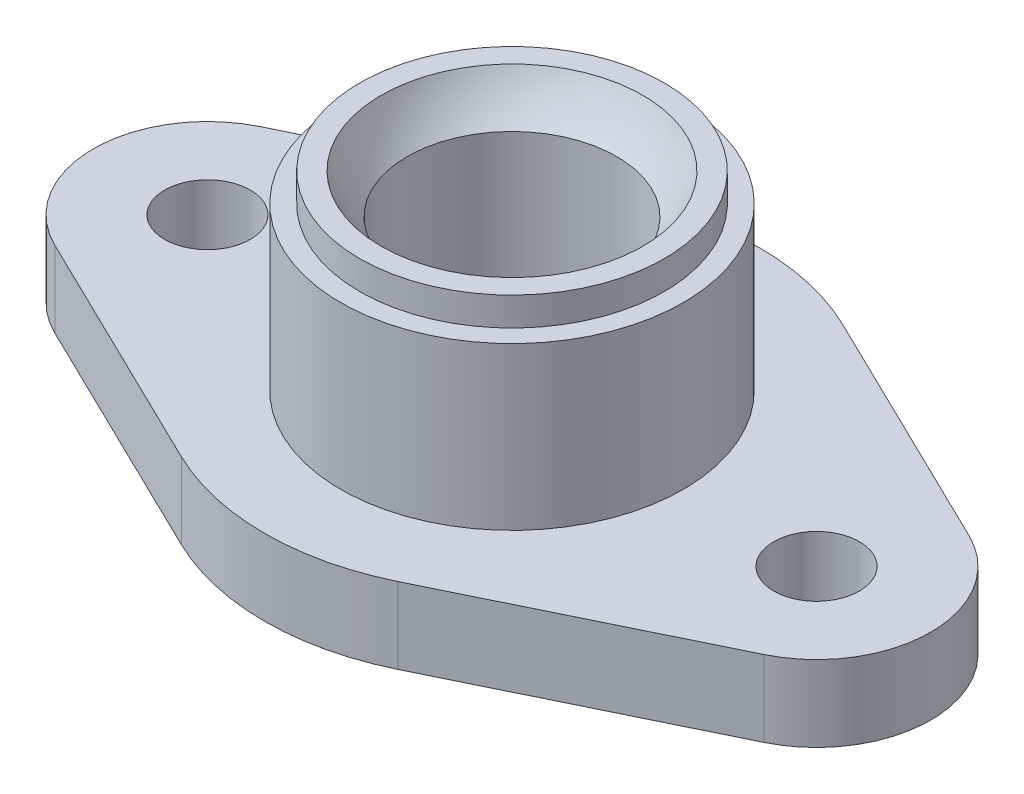
ISO-10303-21;
HEADER;
FILE_DESCRIPTION(('STEP AP214'),'2;1');
FILE_NAME('part.step','',(''),(''),'','','');
FILE_SCHEMA(('AUTOMOTIVE_DESIGN { 1 0 10303 214 1 1 1 1 }'));
ENDSEC;
DATA;
#1=APPLICATION_CONTEXT('core data for automotive mechanical design processes');
#2=APPLICATION_PROTOCOL_DEFINITION('international standard','automotive_design',2000,#1);
#3=PRODUCT_CONTEXT('',#1,'mechanical');
#4=PRODUCT('Part','Part','',(#3));
#5=PRODUCT_RELATED_PRODUCT_CATEGORY('part','',(#4));
#6=PRODUCT_DEFINITION_FORMATION('','',#4);
#7=PRODUCT_DEFINITION_CONTEXT('part definition',#1,'design');
#8=PRODUCT_DEFINITION('design','',#6,#7);
#9=PRODUCT_DEFINITION_SHAPE('','',#8);
#10=(LENGTH_UNIT() NAMED_UNIT(*) SI_UNIT(.MILLI.,.METRE.));
#11=(NAMED_UNIT(*) PLANE_ANGLE_UNIT() SI_UNIT($,.RADIAN.));
#12=(NAMED_UNIT(*) SI_UNIT($,.STERADIAN.) SOLID_ANGLE_UNIT());
#13=UNCERTAINTY_MEASURE_WITH_UNIT(LENGTH_MEASURE(1.E-05),#10,'distance_accuracy_value','');
#14=(GEOMETRIC_REPRESENTATION_CONTEXT(3) GLOBAL_UNCERTAINTY_ASSIGNED_CONTEXT((#13)) GLOBAL_UNIT_ASSIGNED_CONTEXT((#10,
#11,#12)) REPRESENTATION_CONTEXT('',''));
#15=CARTESIAN_POINT('',(0.,0.,0.));
#16=DIRECTION('',(0.,0.,1.));
#17=DIRECTION('',(1.,0.,0.));
#18=AXIS2_PLACEMENT_3D('',#15,#16,#17);
#19=CARTESIAN_POINT('',(-32.,8.,0.));
#20=DIRECTION('',(0.,1.,0.));
#21=DIRECTION('',(0.,0.,1.));
#22=AXIS2_PLACEMENT_3D('',#19,#20,#21);
#23=PLANE('',#22);
#24=CARTESIAN_POINT('',(32.,8.,0.));
#25=DIRECTION('',(0.,1.,0.));
#26=DIRECTION('',(0.,0.,1.));
#27=AXIS2_PLACEMENT_3D('',#24,#25,#26);
#28=CIRCLE('',#27,4.5);
#29=CARTESIAN_POINT('',(32.,8.,4.5));
#30=VERTEX_POINT('',#29);
#31=EDGE_CURVE('E273',#30,#30,#28,.T.);
#32=ORIENTED_EDGE('',*,*,#31,.F.);
#33=EDGE_LOOP('',(#32));
#34=FACE_BOUND('',#33,.T.);
#35=CARTESIAN_POINT('',(-32.,8.,0.));
#36=DIRECTION('',(0.,1.,0.));
#37=DIRECTION('',(0.,0.,1.));
#38=AXIS2_PLACEMENT_3D('',#35,#36,#37);
#39=CIRCLE('',#38,12.);
#40=CARTESIAN_POINT('',(-37.25,8.,-10.7906209274536));
#41=VERTEX_POINT('',#40);
#42=CARTESIAN_POINT('',(-37.25,8.,10.7906209274536));
#43=VERTEX_POINT('',#42);
#44=EDGE_CURVE('E172',#41,#43,#39,.T.);
#45=ORIENTED_EDGE('',*,*,#44,.T.);
#46=DIRECTION('',(0.899218410621135,0.,0.4375));
#47=VECTOR('',#46,1.);
#48=CARTESIAN_POINT('',(-37.25,8.,10.7906209274536));
#49=LINE('',#48,#47);
#50=CARTESIAN_POINT('',(-11.375,8.,23.3796786761495));
#51=VERTEX_POINT('',#50);
#52=EDGE_CURVE('E108',#43,#51,#49,.T.);
#53=ORIENTED_EDGE('',*,*,#52,.T.);
#54=CARTESIAN_POINT('',(0.,8.,0.));
#55=DIRECTION('',(0.,1.,0.));
#56=DIRECTION('',(0.,0.,1.));
#57=AXIS2_PLACEMENT_3D('',#54,#55,#56);
#58=CIRCLE('',#57,26.);
#59=CARTESIAN_POINT('',(11.375,8.,23.3796786761495));
#60=VERTEX_POINT('',#59);
#61=EDGE_CURVE('E256',#51,#60,#58,.T.);
#62=ORIENTED_EDGE('',*,*,#61,.T.);
#63=DIRECTION('',(0.899218410621135,0.,-0.4375));
#64=VECTOR('',#63,1.);
#65=CARTESIAN_POINT('',(37.25,8.,10.7906209274536));
#66=LINE('',#65,#64);
#67=CARTESIAN_POINT('',(37.25,8.,10.7906209274536));
#68=VERTEX_POINT('',#67);
#69=EDGE_CURVE('E259',#60,#68,#66,.T.);
#70=ORIENTED_EDGE('',*,*,#69,.T.);
#71=CARTESIAN_POINT('',(32.,8.,0.));
#72=DIRECTION('',(0.,1.,0.));
#73=DIRECTION('',(0.,0.,-1.));
#74=AXIS2_PLACEMENT_3D('',#71,#72,#73);
#75=CIRCLE('',#74,12.);
#76=CARTESIAN_POINT('',(37.25,8.,-10.7906209274536));
#77=VERTEX_POINT('',#76);
#78=EDGE_CURVE('E127',#68,#77,#75,.T.);
#79=ORIENTED_EDGE('',*,*,#78,.T.);
#80=DIRECTION('',(-0.899218410621135,0.,-0.4375));
#81=VECTOR('',#80,1.);
#82=CARTESIAN_POINT('',(37.25,8.,-10.7906209274536));
#83=LINE('',#82,#81);
#84=CARTESIAN_POINT('',(11.375,8.,-23.3796786761495));
#85=VERTEX_POINT('',#84);
#86=EDGE_CURVE('E121',#77,#85,#83,.T.);
#87=ORIENTED_EDGE('',*,*,#86,.T.);
#88=CARTESIAN_POINT('',(0.,8.,0.));
#89=DIRECTION('',(0.,1.,0.));
#90=DIRECTION('',(0.,0.,1.));
#91=AXIS2_PLACEMENT_3D('',#88,#89,#90);
#92=CIRCLE('',#91,26.);
#93=CARTESIAN_POINT('',(-11.375,8.,-23.3796786761495));
#94=VERTEX_POINT('',#93);
#95=EDGE_CURVE('E125',#85,#94,#92,.T.);
#96=ORIENTED_EDGE('',*,*,#95,.T.);
#97=DIRECTION('',(-0.899218410621135,0.,0.4375));
#98=VECTOR('',#97,1.);
#99=CARTESIAN_POINT('',(-37.25,8.,-10.7906209274536));
#100=LINE('',#99,#98);
#101=EDGE_CURVE('E64',#94,#41,#100,.T.);
#102=ORIENTED_EDGE('',*,*,#101,.T.);
#103=EDGE_LOOP('',(#45,#53,#62,#70,#79,#87,#96,#102));
#104=FACE_BOUND('',#103,.T.);
#105=CARTESIAN_POINT('',(-32.,8.,0.));
#106=DIRECTION('',(0.,1.,0.));
#107=DIRECTION('',(0.,0.,1.));
#108=AXIS2_PLACEMENT_3D('',#105,#106,#107);
#109=CIRCLE('',#108,4.5);
#110=CARTESIAN_POINT('',(-32.,8.,4.5));
#111=VERTEX_POINT('',#110);
#112=EDGE_CURVE('E154',#111,#111,#109,.T.);
#113=ORIENTED_EDGE('',*,*,#112,.F.);
#114=EDGE_LOOP('',(#113));
#115=FACE_BOUND('',#114,.T.);
#116=CARTESIAN_POINT('',(0.,7.99999999999999,0.));
#117=DIRECTION('',(0.,-1.,0.));
#118=DIRECTION('',(0.,0.,-1.));
#119=AXIS2_PLACEMENT_3D('',#116,#117,#118);
#120=CIRCLE('',#119,18.);
#121=CARTESIAN_POINT('',(0.,7.99999999999999,-18.));
#122=VERTEX_POINT('',#121);
#123=EDGE_CURVE('E281',#122,#122,#120,.T.);
#124=ORIENTED_EDGE('',*,*,#123,.T.);
#125=EDGE_LOOP('',(#124));
#126=FACE_BOUND('',#125,.T.);
#127=ADVANCED_FACE('F45',(#34,#104,#115,#126),#23,.T.);
#128=CARTESIAN_POINT('',(-32.,0.,0.));
#129=DIRECTION('',(0.,1.,0.));
#130=DIRECTION('',(0.,0.,1.));
#131=AXIS2_PLACEMENT_3D('',#128,#129,#130);
#132=PLANE('',#131);
#133=CARTESIAN_POINT('',(0.,0.,0.));
#134=DIRECTION('',(0.,1.,0.));
#135=DIRECTION('',(0.,0.,1.));
#136=AXIS2_PLACEMENT_3D('',#133,#134,#135);
#137=CIRCLE('',#136,12.5);
#138=CARTESIAN_POINT('',(0.,0.,12.5));
#139=VERTEX_POINT('',#138);
#140=EDGE_CURVE('E56',#139,#139,#137,.T.);
#141=ORIENTED_EDGE('',*,*,#140,.T.);
#142=EDGE_LOOP('',(#141));
#143=FACE_BOUND('',#142,.T.);
#144=CARTESIAN_POINT('',(-32.,0.,0.));
#145=DIRECTION('',(0.,1.,0.));
#146=DIRECTION('',(0.,0.,1.));
#147=AXIS2_PLACEMENT_3D('',#144,#145,#146);
#148=CIRCLE('',#147,12.);
#149=CARTESIAN_POINT('',(-37.25,0.,-10.7906209274536));
#150=VERTEX_POINT('',#149);
#151=CARTESIAN_POINT('',(-37.25,0.,10.7906209274536));
#152=VERTEX_POINT('',#151);
#153=EDGE_CURVE('E149',#150,#152,#148,.T.);
#154=ORIENTED_EDGE('',*,*,#153,.F.);
#155=DIRECTION('',(-0.899218410621135,0.,0.4375));
#156=VECTOR('',#155,1.);
#157=CARTESIAN_POINT('',(-37.25,0.,-10.7906209274536));
#158=LINE('',#157,#156);
#159=CARTESIAN_POINT('',(-11.375,0.,-23.3796786761495));
#160=VERTEX_POINT('',#159);
#161=EDGE_CURVE('E99',#160,#150,#158,.T.);
#162=ORIENTED_EDGE('',*,*,#161,.F.);
#163=CARTESIAN_POINT('',(0.,0.,0.));
#164=DIRECTION('',(0.,1.,0.));
#165=DIRECTION('',(0.,0.,1.));
#166=AXIS2_PLACEMENT_3D('',#163,#164,#165);
#167=CIRCLE('',#166,26.);
#168=CARTESIAN_POINT('',(11.375,0.,-23.3796786761495));
#169=VERTEX_POINT('',#168);
#170=EDGE_CURVE('E93',#169,#160,#167,.T.);
#171=ORIENTED_EDGE('',*,*,#170,.F.);
#172=DIRECTION('',(-0.899218410621135,0.,-0.4375));
#173=VECTOR('',#172,1.);
#174=CARTESIAN_POINT('',(37.25,0.,-10.7906209274536));
#175=LINE('',#174,#173);
#176=CARTESIAN_POINT('',(37.25,0.,-10.7906209274536));
#177=VERTEX_POINT('',#176);
#178=EDGE_CURVE('E136',#177,#169,#175,.T.);
#179=ORIENTED_EDGE('',*,*,#178,.F.);
#180=CARTESIAN_POINT('',(32.,0.,0.));
#181=DIRECTION('',(0.,1.,0.));
#182=DIRECTION('',(0.,0.,-1.));
#183=AXIS2_PLACEMENT_3D('',#180,#181,#182);
#184=CIRCLE('',#183,12.);
#185=CARTESIAN_POINT('',(37.25,0.,10.7906209274536));
#186=VERTEX_POINT('',#185);
#187=EDGE_CURVE('E163',#186,#177,#184,.T.);
#188=ORIENTED_EDGE('',*,*,#187,.F.);
#189=DIRECTION('',(0.899218410621135,0.,-0.4375));
#190=VECTOR('',#189,1.);
#191=CARTESIAN_POINT('',(37.25,0.,10.7906209274536));
#192=LINE('',#191,#190);
#193=CARTESIAN_POINT('',(11.375,0.,23.3796786761495));
#194=VERTEX_POINT('',#193);
#195=EDGE_CURVE('E160',#194,#186,#192,.T.);
#196=ORIENTED_EDGE('',*,*,#195,.F.);
#197=CARTESIAN_POINT('',(0.,0.,0.));
#198=DIRECTION('',(0.,1.,0.));
#199=DIRECTION('',(0.,0.,1.));
#200=AXIS2_PLACEMENT_3D('',#197,#198,#199);
#201=CIRCLE('',#200,26.);
#202=CARTESIAN_POINT('',(-11.375,0.,23.3796786761495));
#203=VERTEX_POINT('',#202);
#204=EDGE_CURVE('E157',#203,#194,#201,.T.);
#205=ORIENTED_EDGE('',*,*,#204,.F.);
#206=DIRECTION('',(0.899218410621135,0.,0.4375));
#207=VECTOR('',#206,1.);
#208=CARTESIAN_POINT('',(-37.25,0.,10.7906209274536));
#209=LINE('',#208,#207);
#210=EDGE_CURVE('E153',#152,#203,#209,.T.);
#211=ORIENTED_EDGE('',*,*,#210,.F.);
#212=EDGE_LOOP('',(#154,#162,#171,#179,#188,#196,#205,#211));
#213=FACE_BOUND('',#212,.T.);
#214=CARTESIAN_POINT('',(-32.,0.,0.));
#215=DIRECTION('',(0.,1.,0.));
#216=DIRECTION('',(0.,0.,1.));
#217=AXIS2_PLACEMENT_3D('',#214,#215,#216);
#218=CIRCLE('',#217,4.5);
#219=CARTESIAN_POINT('',(-32.,0.,4.5));
#220=VERTEX_POINT('',#219);
#221=EDGE_CURVE('E269',#220,#220,#218,.T.);
#222=ORIENTED_EDGE('',*,*,#221,.T.);
#223=EDGE_LOOP('',(#222));
#224=FACE_BOUND('',#223,.T.);
#225=CARTESIAN_POINT('',(32.,0.,0.));
#226=DIRECTION('',(0.,1.,0.));
#227=DIRECTION('',(0.,0.,1.));
#228=AXIS2_PLACEMENT_3D('',#225,#226,#227);
#229=CIRCLE('',#228,4.5);
#230=CARTESIAN_POINT('',(32.,0.,4.5));
#231=VERTEX_POINT('',#230);
#232=EDGE_CURVE('E277',#231,#231,#229,.T.);
#233=ORIENTED_EDGE('',*,*,#232,.T.);
#234=EDGE_LOOP('',(#233));
#235=FACE_BOUND('',#234,.T.);
#236=ADVANCED_FACE('F197',(#143,#213,#224,#235),#132,.F.);
#237=CARTESIAN_POINT('',(-32.,8.,0.));
#238=DIRECTION('',(0.,-1.,0.));
#239=DIRECTION('',(0.,0.,-1.));
#240=AXIS2_PLACEMENT_3D('',#237,#238,#239);
#241=CYLINDRICAL_SURFACE('',#240,12.);
#242=ORIENTED_EDGE('',*,*,#153,.T.);
#243=DIRECTION('',(0.,-1.,0.));
#244=VECTOR('',#243,1.);
#245=CARTESIAN_POINT('',(-37.25,8.,10.7906209274536));
#246=LINE('',#245,#244);
#247=EDGE_CURVE('E191',#43,#152,#246,.T.);
#248=ORIENTED_EDGE('',*,*,#247,.F.);
#249=ORIENTED_EDGE('',*,*,#44,.F.);
#250=DIRECTION('',(0.,-1.,0.));
#251=VECTOR('',#250,1.);
#252=CARTESIAN_POINT('',(-37.25,8.,-10.7906209274536));
#253=LINE('',#252,#251);
#254=EDGE_CURVE('E145',#41,#150,#253,.T.);
#255=ORIENTED_EDGE('',*,*,#254,.T.);
#256=EDGE_LOOP('',(#242,#248,#249,#255));
#257=FACE_BOUND('',#256,.T.);
#258=ADVANCED_FACE('F216',(#257),#241,.T.);
#259=CARTESIAN_POINT('',(-37.25,8.,10.7906209274536));
#260=DIRECTION('',(0.4375,0.,-0.899218410621135));
#261=DIRECTION('',(-0.899218410621135,0.,-0.4375));
#262=AXIS2_PLACEMENT_3D('',#259,#260,#261);
#263=PLANE('',#262);
#264=ORIENTED_EDGE('',*,*,#210,.T.);
#265=DIRECTION('',(0.,-1.,0.));
#266=VECTOR('',#265,1.);
#267=CARTESIAN_POINT('',(-11.375,8.,23.3796786761495));
#268=LINE('',#267,#266);
#269=EDGE_CURVE('E187',#51,#203,#268,.T.);
#270=ORIENTED_EDGE('',*,*,#269,.F.);
#271=ORIENTED_EDGE('',*,*,#52,.F.);
#272=ORIENTED_EDGE('',*,*,#247,.T.);
#273=EDGE_LOOP('',(#264,#270,#271,#272));
#274=FACE_BOUND('',#273,.T.);
#275=ADVANCED_FACE('F241',(#274),#263,.F.);
#276=CARTESIAN_POINT('',(0.,8.,0.));
#277=DIRECTION('',(0.,-1.,0.));
#278=DIRECTION('',(0.,0.,-1.));
#279=AXIS2_PLACEMENT_3D('',#276,#277,#278);
#280=CYLINDRICAL_SURFACE('',#279,26.);
#281=ORIENTED_EDGE('',*,*,#204,.T.);
#282=DIRECTION('',(0.,-1.,0.));
#283=VECTOR('',#282,1.);
#284=CARTESIAN_POINT('',(11.375,8.,23.3796786761495));
#285=LINE('',#284,#283);
#286=EDGE_CURVE('E183',#60,#194,#285,.T.);
#287=ORIENTED_EDGE('',*,*,#286,.F.);
#288=ORIENTED_EDGE('',*,*,#61,.F.);
#289=ORIENTED_EDGE('',*,*,#269,.T.);
#290=EDGE_LOOP('',(#281,#287,#288,#289));
#291=FACE_BOUND('',#290,.T.);
#292=ADVANCED_FACE('F237',(#291),#280,.T.);
#293=CARTESIAN_POINT('',(37.25,8.,10.7906209274536));
#294=DIRECTION('',(-0.4375,0.,-0.899218410621135));
#295=DIRECTION('',(-0.899218410621135,0.,0.4375));
#296=AXIS2_PLACEMENT_3D('',#293,#294,#295);
#297=PLANE('',#296);
#298=ORIENTED_EDGE('',*,*,#195,.T.);
#299=DIRECTION('',(0.,-1.,0.));
#300=VECTOR('',#299,1.);
#301=CARTESIAN_POINT('',(37.25,8.,10.7906209274536));
#302=LINE('',#301,#300);
#303=EDGE_CURVE('E179',#68,#186,#302,.T.);
#304=ORIENTED_EDGE('',*,*,#303,.F.);
#305=ORIENTED_EDGE('',*,*,#69,.F.);
#306=ORIENTED_EDGE('',*,*,#286,.T.);
#307=EDGE_LOOP('',(#298,#304,#305,#306));
#308=FACE_BOUND('',#307,.T.);
#309=ADVANCED_FACE('F233',(#308),#297,.F.);
#310=CARTESIAN_POINT('',(32.,8.,0.));
#311=DIRECTION('',(0.,-1.,0.));
#312=DIRECTION('',(0.,0.,-1.));
#313=AXIS2_PLACEMENT_3D('',#310,#311,#312);
#314=CYLINDRICAL_SURFACE('',#313,12.);
#315=ORIENTED_EDGE('',*,*,#187,.T.);
#316=DIRECTION('',(0.,-1.,0.));
#317=VECTOR('',#316,1.);
#318=CARTESIAN_POINT('',(37.25,8.,-10.7906209274536));
#319=LINE('',#318,#317);
#320=EDGE_CURVE('E138',#77,#177,#319,.T.);
#321=ORIENTED_EDGE('',*,*,#320,.F.);
#322=ORIENTED_EDGE('',*,*,#78,.F.);
#323=ORIENTED_EDGE('',*,*,#303,.T.);
#324=EDGE_LOOP('',(#315,#321,#322,#323));
#325=FACE_BOUND('',#324,.T.);
#326=ADVANCED_FACE('F230',(#325),#314,.T.);
#327=CARTESIAN_POINT('',(37.25,8.,-10.7906209274536));
#328=DIRECTION('',(-0.4375,0.,0.899218410621135));
#329=DIRECTION('',(0.899218410621135,0.,0.4375));
#330=AXIS2_PLACEMENT_3D('',#327,#328,#329);
#331=PLANE('',#330);
#332=ORIENTED_EDGE('',*,*,#178,.T.);
#333=DIRECTION('',(0.,-1.,0.));
#334=VECTOR('',#333,1.);
#335=CARTESIAN_POINT('',(11.375,8.,-23.3796786761495));
#336=LINE('',#335,#334);
#337=EDGE_CURVE('E133',#85,#169,#336,.T.);
#338=ORIENTED_EDGE('',*,*,#337,.F.);
#339=ORIENTED_EDGE('',*,*,#86,.F.);
#340=ORIENTED_EDGE('',*,*,#320,.T.);
#341=EDGE_LOOP('',(#332,#338,#339,#340));
#342=FACE_BOUND('',#341,.T.);
#343=ADVANCED_FACE('F134',(#342),#331,.F.);
#344=CARTESIAN_POINT('',(0.,8.,0.));
#345=DIRECTION('',(0.,-1.,0.));
#346=DIRECTION('',(0.,0.,-1.));
#347=AXIS2_PLACEMENT_3D('',#344,#345,#346);
#348=CYLINDRICAL_SURFACE('',#347,26.);
#349=ORIENTED_EDGE('',*,*,#170,.T.);
#350=DIRECTION('',(0.,-1.,0.));
#351=VECTOR('',#350,1.);
#352=CARTESIAN_POINT('',(-11.375,8.,-23.3796786761495));
#353=LINE('',#352,#351);
#354=EDGE_CURVE('E139',#94,#160,#353,.T.);
#355=ORIENTED_EDGE('',*,*,#354,.F.);
#356=ORIENTED_EDGE('',*,*,#95,.F.);
#357=ORIENTED_EDGE('',*,*,#337,.T.);
#358=EDGE_LOOP('',(#349,#355,#356,#357));
#359=FACE_BOUND('',#358,.T.);
#360=ADVANCED_FACE('F141',(#359),#348,.T.);
#361=CARTESIAN_POINT('',(-37.25,8.,-10.7906209274536));
#362=DIRECTION('',(0.4375,0.,0.899218410621135));
#363=DIRECTION('',(0.899218410621135,0.,-0.4375));
#364=AXIS2_PLACEMENT_3D('',#361,#362,#363);
#365=PLANE('',#364);
#366=ORIENTED_EDGE('',*,*,#161,.T.);
#367=ORIENTED_EDGE('',*,*,#254,.F.);
#368=ORIENTED_EDGE('',*,*,#101,.F.);
#369=ORIENTED_EDGE('',*,*,#354,.T.);
#370=EDGE_LOOP('',(#366,#367,#368,#369));
#371=FACE_BOUND('',#370,.T.);
#372=ADVANCED_FACE('F223',(#371),#365,.F.);
#373=CARTESIAN_POINT('',(0.,8.,0.));
#374=DIRECTION('',(0.,-1.,0.));
#375=DIRECTION('',(0.,0.,-1.));
#376=AXIS2_PLACEMENT_3D('',#373,#374,#375);
#377=CYLINDRICAL_SURFACE('',#376,11.);
#378=CARTESIAN_POINT('',(0.,1.50000000000002,0.));
#379=DIRECTION('',(0.,1.,0.));
#380=DIRECTION('',(0.,0.,1.));
#381=AXIS2_PLACEMENT_3D('',#378,#379,#380);
#382=CIRCLE('',#381,11.);
#383=CARTESIAN_POINT('',(0.,1.50000000000002,11.));
#384=VERTEX_POINT('',#383);
#385=EDGE_CURVE('E11',#384,#384,#382,.F.);
#386=ORIENTED_EDGE('',*,*,#385,.T.);
#387=EDGE_LOOP('',(#386));
#388=FACE_BOUND('',#387,.T.);
#389=CARTESIAN_POINT('',(0.,23.8019609728144,0.));
#390=DIRECTION('',(0.,-1.,0.));
#391=DIRECTION('',(0.,0.,-1.));
#392=AXIS2_PLACEMENT_3D('',#389,#390,#391);
#393=CIRCLE('',#392,11.);
#394=CARTESIAN_POINT('',(0.,23.8019609728144,11.));
#395=VERTEX_POINT('',#394);
#396=EDGE_CURVE('E288',#395,#395,#393,.T.);
#397=ORIENTED_EDGE('',*,*,#396,.F.);
#398=EDGE_LOOP('',(#397));
#399=FACE_BOUND('',#398,.T.);
#400=ADVANCED_FACE('F220',(#388,#399),#377,.F.);
#401=CARTESIAN_POINT('',(-32.,8.,0.));
#402=DIRECTION('',(0.,-1.,0.));
#403=DIRECTION('',(0.,0.,-1.));
#404=AXIS2_PLACEMENT_3D('',#401,#402,#403);
#405=CYLINDRICAL_SURFACE('',#404,4.5);
#406=ORIENTED_EDGE('',*,*,#112,.T.);
#407=EDGE_LOOP('',(#406));
#408=FACE_BOUND('',#407,.T.);
#409=ORIENTED_EDGE('',*,*,#221,.F.);
#410=EDGE_LOOP('',(#409));
#411=FACE_BOUND('',#410,.T.);
#412=ADVANCED_FACE('F331',(#408,#411),#405,.F.);
#413=CARTESIAN_POINT('',(32.,8.,0.));
#414=DIRECTION('',(0.,-1.,0.));
#415=DIRECTION('',(0.,0.,-1.));
#416=AXIS2_PLACEMENT_3D('',#413,#414,#415);
#417=CYLINDRICAL_SURFACE('',#416,4.5);
#418=ORIENTED_EDGE('',*,*,#31,.T.);
#419=EDGE_LOOP('',(#418));
#420=FACE_BOUND('',#419,.T.);
#421=ORIENTED_EDGE('',*,*,#232,.F.);
#422=EDGE_LOOP('',(#421));
#423=FACE_BOUND('',#422,.T.);
#424=ADVANCED_FACE('F336',(#420,#423),#417,.F.);
#425=CARTESIAN_POINT('',(0.,0.,0.));
#426=DIRECTION('',(0.,-1.,0.));
#427=DIRECTION('',(0.,0.,-1.));
#428=AXIS2_PLACEMENT_3D('',#425,#426,#427);
#429=CYLINDRICAL_SURFACE('',#428,18.);
#430=ORIENTED_EDGE('',*,*,#123,.F.);
#431=EDGE_LOOP('',(#430));
#432=FACE_BOUND('',#431,.T.);
#433=CARTESIAN_POINT('',(0.,25.,0.));
#434=DIRECTION('',(0.,-1.,0.));
#435=DIRECTION('',(0.,0.,-1.));
#436=AXIS2_PLACEMENT_3D('',#433,#434,#435);
#437=CIRCLE('',#436,18.);
#438=CARTESIAN_POINT('',(0.,25.,-18.));
#439=VERTEX_POINT('',#438);
#440=EDGE_CURVE('E304',#439,#439,#437,.T.);
#441=ORIENTED_EDGE('',*,*,#440,.T.);
#442=EDGE_LOOP('',(#441));
#443=FACE_BOUND('',#442,.T.);
#444=ADVANCED_FACE('F309',(#432,#443),#429,.T.);
#445=CARTESIAN_POINT('',(0.,34.,0.));
#446=DIRECTION('',(0.,-1.,0.));
#447=DIRECTION('',(0.,0.,1.));
#448=AXIS2_PLACEMENT_3D('',#445,#446,#447);
#449=SPHERICAL_SURFACE('',#448,15.);
#450=CARTESIAN_POINT('',(0.,28.,0.));
#451=DIRECTION('',(0.,-1.,0.));
#452=DIRECTION('',(0.,0.,-1.));
#453=AXIS2_PLACEMENT_3D('',#450,#451,#452);
#454=CIRCLE('',#453,13.7477270848675);
#455=CARTESIAN_POINT('',(0.,28.,13.7477270848675));
#456=VERTEX_POINT('',#455);
#457=EDGE_CURVE('E292',#456,#456,#454,.T.);
#458=CARTESIAN_POINT('',(0.,28.,13.7477270848675));
#459=CARTESIAN_POINT('',(0.,27.9518732838464,13.7267228758571));
#460=CARTESIAN_POINT('',(0.,27.9038568707585,13.7054659312694));
#461=CARTESIAN_POINT('',(0.,27.8080499269537,13.6624489591984));
#462=CARTESIAN_POINT('',(0.,27.7602593962369,13.6406889317152));
#463=CARTESIAN_POINT('',(0.,27.6649094934141,13.5966681821128));
#464=CARTESIAN_POINT('',(0.,27.617350121308,13.5744074599935));
#465=CARTESIAN_POINT('',(0.,27.5224677797756,13.529387779469));
#466=CARTESIAN_POINT('',(0.,27.4751448103492,13.5066288210638));
#467=CARTESIAN_POINT('',(0.,27.3807404939601,13.4606151772859));
#468=CARTESIAN_POINT('',(0.,27.3336591469974,13.4373604919133));
#469=CARTESIAN_POINT('',(0.,27.2397432681909,13.390357959262));
#470=CARTESIAN_POINT('',(0.,27.1929087363473,13.3666101119833));
#471=CARTESIAN_POINT('',(0.,27.0994916533406,13.3186238746876));
#472=CARTESIAN_POINT('',(0.,27.0529091021777,13.2943854846706));
#473=CARTESIAN_POINT('',(0.,26.9600011182682,13.2454208352462));
#474=CARTESIAN_POINT('',(0.,26.9136756855216,13.2206945758389));
#475=CARTESIAN_POINT('',(0.,26.821287047831,13.17075691477));
#476=CARTESIAN_POINT('',(0.,26.7752238428871,13.1455455131085));
#477=CARTESIAN_POINT('',(0.,26.6833647412637,13.0946403481809));
#478=CARTESIAN_POINT('',(0.,26.6375688445843,13.0689465849148));
#479=CARTESIAN_POINT('',(0.,26.5462494104703,13.0170795306274));
#480=CARTESIAN_POINT('',(0.,26.5007258730357,12.9909062396061));
#481=CARTESIAN_POINT('',(0.,26.409956178352,12.9380830165467));
#482=CARTESIAN_POINT('',(0.,26.3647100211029,12.9114330845087));
#483=CARTESIAN_POINT('',(0.,26.2745000771377,12.8576595187245));
#484=CARTESIAN_POINT('',(0.,26.2295362904216,12.8305358849783));
#485=CARTESIAN_POINT('',(0.,26.1398960467264,12.7758179073328));
#486=CARTESIAN_POINT('',(0.,26.0952195897473,12.7482235634333));
#487=CARTESIAN_POINT('',(0.,26.0061589330395,12.6925672089522));
#488=CARTESIAN_POINT('',(0.,25.9617747333109,12.6645051983704));
#489=CARTESIAN_POINT('',(0.,25.8733034863833,12.6079166055761));
#490=CARTESIAN_POINT('',(0.,25.8292164391845,12.5793900233635));
#491=CARTESIAN_POINT('',(0.,25.7413443598221,12.5218754335982));
#492=CARTESIAN_POINT('',(0.,25.6975593276585,12.4928874260453));
#493=CARTESIAN_POINT('',(0.,25.610296107562,12.4344531827822));
#494=CARTESIAN_POINT('',(0.,25.566817919629,12.4050069470719));
#495=CARTESIAN_POINT('',(0.,25.4801731833459,12.3456594952159));
#496=CARTESIAN_POINT('',(0.,25.4370066349959,12.3157582790703));
#497=CARTESIAN_POINT('',(0.,25.3509899388594,12.2555041642472));
#498=CARTESIAN_POINT('',(0.,25.3081397910729,12.2251512655698));
#499=CARTESIAN_POINT('',(0.,25.2227606221473,12.1639971334041));
#500=CARTESIAN_POINT('',(0.,25.1802316010082,12.133195899916));
#501=CARTESIAN_POINT('',(0.,25.095499376043,12.0711484952982));
#502=CARTESIAN_POINT('',(0.,25.0532961722169,12.0399023241687));
#503=CARTESIAN_POINT('',(0.,24.9692202366079,11.9769684905112));
#504=CARTESIAN_POINT('',(0.,24.927347504825,11.9452808279833));
#505=CARTESIAN_POINT('',(0.,24.8439371315837,11.8814675064658));
#506=CARTESIAN_POINT('',(0.,24.8023994901252,11.8493418474762));
#507=CARTESIAN_POINT('',(0.,24.7196638788566,11.7846560762792));
#508=CARTESIAN_POINT('',(0.,24.6784659090465,11.7520959640717));
#509=CARTESIAN_POINT('',(0.,24.596414184931,11.6865448776042));
#510=CARTESIAN_POINT('',(0.,24.5555604306257,11.6535539033442));
#511=CARTESIAN_POINT('',(0.,24.4742016434268,11.5871447314417));
#512=CARTESIAN_POINT('',(0.,24.4336966105331,11.5537265337992));
#513=CARTESIAN_POINT('',(0.,24.3530397335464,11.4864666009835));
#514=CARTESIAN_POINT('',(0.,24.3128878894533,11.4526248658104));
#515=CARTESIAN_POINT('',(0.,24.2329418187127,11.3845215902669));
#516=CARTESIAN_POINT('',(0.,24.1931475920653,11.3502600498965));
#517=CARTESIAN_POINT('',(0.,24.113921144632,11.2813209434596));
#518=CARTESIAN_POINT('',(0.,24.0744889238462,11.2466433773932));
#519=CARTESIAN_POINT('',(0.,23.9959908395604,11.176876041717));
#520=CARTESIAN_POINT('',(0.,23.9569249760604,11.1417862721073));
#521=CARTESIAN_POINT('',(0.,23.8791639064096,11.0711984090279));
#522=CARTESIAN_POINT('',(0.,23.8404687002588,11.0357003155581));
#523=CARTESIAN_POINT('',(0.,23.8019609728144,11.));
#524=B_SPLINE_CURVE_WITH_KNOTS('',3,(#458,#459,#460,#461,#462,#463,#464,#465,#466,#467,#468,
#469,#470,#471,#472,#473,#474,#475,#476,#477,#478,#479,#480,#481,#482,#483,#484,#485,#486,#487,
#488,#489,#490,#491,#492,#493,#494,#495,#496,#497,#498,#499,#500,#501,#502,#503,#504,#505,#506,
#507,#508,#509,#510,#511,#512,#513,#514,#515,#516,#517,#518,#519,#520,#521,#522,#523),
.UNSPECIFIED.,.F.,.F.,(4,2,2,2,2,2,2,2,2,2,2,2,2,2,2,2,2,2,2,2,2,2,2,2,2,2,2,2,2,2,2,2,4),(0.,
0.157530918362433,0.315061836724865,0.472592755087299,0.630123673449732,0.787654591812167,
0.945185510174599,1.10271642853703,1.26024734689947,1.4177782652619,1.57530918362433,
1.73284010198677,1.8903710203492,2.04790193871163,2.20543285707406,2.3629637754365,
2.52049469379893,2.67802561216137,2.8355565305238,2.99308744888623,3.15061836724866,
3.3081492856111,3.46568020397353,3.62321112233597,3.7807420406984,3.93827295906083,
4.09580387742327,4.2533347957857,4.41086571414814,4.56839663251057,4.725927550873,
4.88345846923543,5.04098938759787),.UNSPECIFIED.);
#525=EDGE_CURVE('BSEAM321',#456,#395,#524,.T.);
#526=ORIENTED_EDGE('',*,*,#457,.F.);
#527=ORIENTED_EDGE('',*,*,#396,.T.);
#528=ORIENTED_EDGE('',*,*,#525,.T.);
#529=ORIENTED_EDGE('',*,*,#525,.F.);
#530=EDGE_LOOP('',(#526,#528,#527,#529));
#531=FACE_BOUND('',#530,.T.);
#532=ADVANCED_FACE('F321',(#531),#449,.F.);
#533=CARTESIAN_POINT('',(0.,28.,13.7477270848675));
#534=DIRECTION('',(0.,-1.,0.));
#535=DIRECTION('',(0.,0.,-1.));
#536=AXIS2_PLACEMENT_3D('',#533,#534,#535);
#537=PLANE('',#536);
#538=CARTESIAN_POINT('',(0.,28.,0.));
#539=DIRECTION('',(0.,-1.,0.));
#540=DIRECTION('',(0.,0.,-1.));
#541=AXIS2_PLACEMENT_3D('',#538,#539,#540);
#542=CIRCLE('',#541,16.);
#543=CARTESIAN_POINT('',(0.,28.,-16.));
#544=VERTEX_POINT('',#543);
#545=EDGE_CURVE('E296',#544,#544,#542,.T.);
#546=ORIENTED_EDGE('',*,*,#545,.F.);
#547=EDGE_LOOP('',(#546));
#548=FACE_BOUND('',#547,.T.);
#549=ORIENTED_EDGE('',*,*,#457,.T.);
#550=EDGE_LOOP('',(#549));
#551=FACE_BOUND('',#550,.T.);
#552=ADVANCED_FACE('F315',(#548,#551),#537,.F.);
#553=CARTESIAN_POINT('',(0.,0.,0.));
#554=DIRECTION('',(0.,-1.,0.));
#555=DIRECTION('',(0.,0.,-1.));
#556=AXIS2_PLACEMENT_3D('',#553,#554,#555);
#557=CYLINDRICAL_SURFACE('',#556,16.);
#558=CARTESIAN_POINT('',(0.,25.,0.));
#559=DIRECTION('',(0.,-1.,0.));
#560=DIRECTION('',(0.,0.,-1.));
#561=AXIS2_PLACEMENT_3D('',#558,#559,#560);
#562=CIRCLE('',#561,16.);
#563=CARTESIAN_POINT('',(0.,25.,-16.));
#564=VERTEX_POINT('',#563);
#565=EDGE_CURVE('E300',#564,#564,#562,.T.);
#566=ORIENTED_EDGE('',*,*,#565,.F.);
#567=EDGE_LOOP('',(#566));
#568=FACE_BOUND('',#567,.T.);
#569=ORIENTED_EDGE('',*,*,#545,.T.);
#570=EDGE_LOOP('',(#569));
#571=FACE_BOUND('',#570,.T.);
#572=ADVANCED_FACE('F206',(#568,#571),#557,.T.);
#573=CARTESIAN_POINT('',(0.,25.,18.));
#574=DIRECTION('',(0.,-1.,0.));
#575=DIRECTION('',(0.,0.,-1.));
#576=AXIS2_PLACEMENT_3D('',#573,#574,#575);
#577=PLANE('',#576);
#578=ORIENTED_EDGE('',*,*,#440,.F.);
#579=EDGE_LOOP('',(#578));
#580=FACE_BOUND('',#579,.T.);
#581=ORIENTED_EDGE('',*,*,#565,.T.);
#582=EDGE_LOOP('',(#581));
#583=FACE_BOUND('',#582,.T.);
#584=ADVANCED_FACE('F201',(#580,#583),#577,.F.);
#585=CARTESIAN_POINT('',(0.,0.,0.));
#586=DIRECTION('',(0.,-1.,0.));
#587=DIRECTION('',(0.,0.,-1.));
#588=AXIS2_PLACEMENT_3D('',#585,#586,#587);
#589=CONICAL_SURFACE('',#588,12.5,0.785398163397447);
#590=ORIENTED_EDGE('',*,*,#385,.F.);
#591=EDGE_LOOP('',(#590));
#592=FACE_BOUND('',#591,.T.);
#593=ORIENTED_EDGE('',*,*,#140,.F.);
#594=EDGE_LOOP('',(#593));
#595=FACE_BOUND('',#594,.T.);
#596=ADVANCED_FACE('F48',(#592,#595),#589,.F.);
#597=CLOSED_SHELL('',(#127,#236,#258,#275,#292,#309,#326,#343,#360,#372,#400,#412,#424,#444,
#532,#552,#572,#584,#596));
#598=MANIFOLD_SOLID_BREP('B2',#597);
#599=ADVANCED_BREP_SHAPE_REPRESENTATION('',(#18,#598),#14);
#600=SHAPE_DEFINITION_REPRESENTATION(#9,#599);
ENDSEC;
END-ISO-10303-21;
